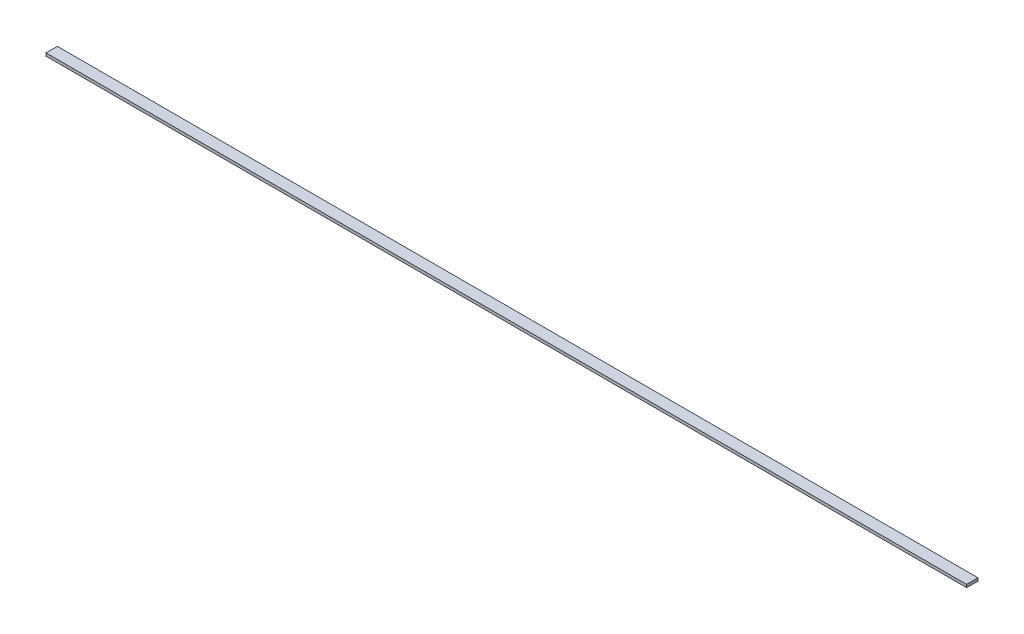
ISO-10303-21;
HEADER;
FILE_DESCRIPTION(('STEP AP214'),'2;1');
FILE_NAME('part.step','',(''),(''),'','','');
FILE_SCHEMA(('AUTOMOTIVE_DESIGN { 1 0 10303 214 1 1 1 1 }'));
ENDSEC;
DATA;
#1=APPLICATION_CONTEXT('core data for automotive mechanical design processes');
#2=APPLICATION_PROTOCOL_DEFINITION('international standard','automotive_design',2000,#1);
#3=PRODUCT_CONTEXT('',#1,'mechanical');
#4=PRODUCT('Part','Part','',(#3));
#5=PRODUCT_RELATED_PRODUCT_CATEGORY('part','',(#4));
#6=PRODUCT_DEFINITION_FORMATION('','',#4);
#7=PRODUCT_DEFINITION_CONTEXT('part definition',#1,'design');
#8=PRODUCT_DEFINITION('design','',#6,#7);
#9=PRODUCT_DEFINITION_SHAPE('','',#8);
#10=(LENGTH_UNIT() NAMED_UNIT(*) SI_UNIT(.MILLI.,.METRE.));
#11=(NAMED_UNIT(*) PLANE_ANGLE_UNIT() SI_UNIT($,.RADIAN.));
#12=(NAMED_UNIT(*) SI_UNIT($,.STERADIAN.) SOLID_ANGLE_UNIT());
#13=UNCERTAINTY_MEASURE_WITH_UNIT(LENGTH_MEASURE(1.E-05),#10,'distance_accuracy_value','');
#14=(GEOMETRIC_REPRESENTATION_CONTEXT(3) GLOBAL_UNCERTAINTY_ASSIGNED_CONTEXT((#13)) GLOBAL_UNIT_ASSIGNED_CONTEXT((#10,
#11,#12)) REPRESENTATION_CONTEXT('',''));
#15=CARTESIAN_POINT('',(0.,0.,0.));
#16=DIRECTION('',(0.,0.,1.));
#17=DIRECTION('',(1.,0.,0.));
#18=AXIS2_PLACEMENT_3D('',#15,#16,#17);
#19=CARTESIAN_POINT('',(0.,1.5,0.));
#20=DIRECTION('',(1.,0.,0.));
#21=DIRECTION('',(0.,0.,-1.));
#22=AXIS2_PLACEMENT_3D('',#19,#20,#21);
#23=PLANE('',#22);
#24=DIRECTION('',(0.,0.,1.));
#25=VECTOR('',#24,1.);
#26=CARTESIAN_POINT('',(0.,0.,0.));
#27=LINE('',#26,#25);
#28=CARTESIAN_POINT('',(0.,0.,0.));
#29=VERTEX_POINT('',#28);
#30=CARTESIAN_POINT('',(0.,0.,6.));
#31=VERTEX_POINT('',#30);
#32=EDGE_CURVE('E107',#29,#31,#27,.T.);
#33=ORIENTED_EDGE('',*,*,#32,.T.);
#34=DIRECTION('',(0.,-1.,0.));
#35=VECTOR('',#34,1.);
#36=CARTESIAN_POINT('',(0.,1.5,6.));
#37=LINE('',#36,#35);
#38=CARTESIAN_POINT('',(0.,1.5,6.));
#39=VERTEX_POINT('',#38);
#40=EDGE_CURVE('E11',#39,#31,#37,.T.);
#41=ORIENTED_EDGE('',*,*,#40,.F.);
#42=DIRECTION('',(0.,0.,1.));
#43=VECTOR('',#42,1.);
#44=CARTESIAN_POINT('',(0.,1.5,0.));
#45=LINE('',#44,#43);
#46=CARTESIAN_POINT('',(0.,1.5,0.));
#47=VERTEX_POINT('',#46);
#48=EDGE_CURVE('E91',#47,#39,#45,.T.);
#49=ORIENTED_EDGE('',*,*,#48,.F.);
#50=DIRECTION('',(0.,-1.,0.));
#51=VECTOR('',#50,1.);
#52=CARTESIAN_POINT('',(0.,1.5,0.));
#53=LINE('',#52,#51);
#54=EDGE_CURVE('E103',#47,#29,#53,.T.);
#55=ORIENTED_EDGE('',*,*,#54,.T.);
#56=EDGE_LOOP('',(#33,#41,#49,#55));
#57=FACE_BOUND('',#56,.T.);
#58=ADVANCED_FACE('F39',(#57),#23,.F.);
#59=CARTESIAN_POINT('',(0.,1.5,6.));
#60=DIRECTION('',(0.,0.,-1.));
#61=DIRECTION('',(-1.,0.,0.));
#62=AXIS2_PLACEMENT_3D('',#59,#60,#61);
#63=PLANE('',#62);
#64=DIRECTION('',(1.,0.,0.));
#65=VECTOR('',#64,1.);
#66=CARTESIAN_POINT('',(0.,0.,6.));
#67=LINE('',#66,#65);
#68=CARTESIAN_POINT('',(485.,0.,6.));
#69=VERTEX_POINT('',#68);
#70=EDGE_CURVE('E96',#31,#69,#67,.T.);
#71=ORIENTED_EDGE('',*,*,#70,.T.);
#72=DIRECTION('',(0.,-1.,0.));
#73=VECTOR('',#72,1.);
#74=CARTESIAN_POINT('',(485.,1.5,6.));
#75=LINE('',#74,#73);
#76=CARTESIAN_POINT('',(485.,1.5,6.));
#77=VERTEX_POINT('',#76);
#78=EDGE_CURVE('E48',#77,#69,#75,.T.);
#79=ORIENTED_EDGE('',*,*,#78,.F.);
#80=DIRECTION('',(1.,0.,0.));
#81=VECTOR('',#80,1.);
#82=CARTESIAN_POINT('',(0.,1.5,6.));
#83=LINE('',#82,#81);
#84=EDGE_CURVE('E86',#39,#77,#83,.T.);
#85=ORIENTED_EDGE('',*,*,#84,.F.);
#86=ORIENTED_EDGE('',*,*,#40,.T.);
#87=EDGE_LOOP('',(#71,#79,#85,#86));
#88=FACE_BOUND('',#87,.T.);
#89=ADVANCED_FACE('F95',(#88),#63,.F.);
#90=CARTESIAN_POINT('',(485.,1.5,0.));
#91=DIRECTION('',(-1.,0.,0.));
#92=DIRECTION('',(0.,0.,1.));
#93=AXIS2_PLACEMENT_3D('',#90,#91,#92);
#94=PLANE('',#93);
#95=DIRECTION('',(0.,0.,-1.));
#96=VECTOR('',#95,1.);
#97=CARTESIAN_POINT('',(485.,0.,0.));
#98=LINE('',#97,#96);
#99=CARTESIAN_POINT('',(485.,0.,0.));
#100=VERTEX_POINT('',#99);
#101=EDGE_CURVE('E73',#69,#100,#98,.T.);
#102=ORIENTED_EDGE('',*,*,#101,.T.);
#103=DIRECTION('',(0.,-1.,0.));
#104=VECTOR('',#103,1.);
#105=CARTESIAN_POINT('',(485.,1.5,0.));
#106=LINE('',#105,#104);
#107=CARTESIAN_POINT('',(485.,1.5,0.));
#108=VERTEX_POINT('',#107);
#109=EDGE_CURVE('E98',#108,#100,#106,.T.);
#110=ORIENTED_EDGE('',*,*,#109,.F.);
#111=DIRECTION('',(0.,0.,-1.));
#112=VECTOR('',#111,1.);
#113=CARTESIAN_POINT('',(485.,1.5,0.));
#114=LINE('',#113,#112);
#115=EDGE_CURVE('E89',#77,#108,#114,.T.);
#116=ORIENTED_EDGE('',*,*,#115,.F.);
#117=ORIENTED_EDGE('',*,*,#78,.T.);
#118=EDGE_LOOP('',(#102,#110,#116,#117));
#119=FACE_BOUND('',#118,.T.);
#120=ADVANCED_FACE('F99',(#119),#94,.F.);
#121=CARTESIAN_POINT('',(0.,1.5,0.));
#122=DIRECTION('',(0.,0.,1.));
#123=DIRECTION('',(1.,0.,0.));
#124=AXIS2_PLACEMENT_3D('',#121,#122,#123);
#125=PLANE('',#124);
#126=DIRECTION('',(-1.,0.,0.));
#127=VECTOR('',#126,1.);
#128=CARTESIAN_POINT('',(0.,0.,0.));
#129=LINE('',#128,#127);
#130=EDGE_CURVE('E79',#100,#29,#129,.T.);
#131=ORIENTED_EDGE('',*,*,#130,.T.);
#132=ORIENTED_EDGE('',*,*,#54,.F.);
#133=DIRECTION('',(-1.,0.,0.));
#134=VECTOR('',#133,1.);
#135=CARTESIAN_POINT('',(0.,1.5,0.));
#136=LINE('',#135,#134);
#137=EDGE_CURVE('E56',#108,#47,#136,.T.);
#138=ORIENTED_EDGE('',*,*,#137,.F.);
#139=ORIENTED_EDGE('',*,*,#109,.T.);
#140=EDGE_LOOP('',(#131,#132,#138,#139));
#141=FACE_BOUND('',#140,.T.);
#142=ADVANCED_FACE('F120',(#141),#125,.F.);
#143=CARTESIAN_POINT('',(0.,1.5,0.));
#144=DIRECTION('',(0.,1.,0.));
#145=DIRECTION('',(0.,0.,1.));
#146=AXIS2_PLACEMENT_3D('',#143,#144,#145);
#147=PLANE('',#146);
#148=ORIENTED_EDGE('',*,*,#48,.T.);
#149=ORIENTED_EDGE('',*,*,#84,.T.);
#150=ORIENTED_EDGE('',*,*,#115,.T.);
#151=ORIENTED_EDGE('',*,*,#137,.T.);
#152=EDGE_LOOP('',(#148,#149,#150,#151));
#153=FACE_BOUND('',#152,.T.);
#154=ADVANCED_FACE('F87',(#153),#147,.T.);
#155=CARTESIAN_POINT('',(0.,0.,0.));
#156=DIRECTION('',(0.,1.,0.));
#157=DIRECTION('',(0.,0.,1.));
#158=AXIS2_PLACEMENT_3D('',#155,#156,#157);
#159=PLANE('',#158);
#160=ORIENTED_EDGE('',*,*,#32,.F.);
#161=ORIENTED_EDGE('',*,*,#130,.F.);
#162=ORIENTED_EDGE('',*,*,#101,.F.);
#163=ORIENTED_EDGE('',*,*,#70,.F.);
#164=EDGE_LOOP('',(#160,#161,#162,#163));
#165=FACE_BOUND('',#164,.T.);
#166=ADVANCED_FACE('F123',(#165),#159,.F.);
#167=CLOSED_SHELL('',(#58,#89,#120,#142,#154,#166));
#168=MANIFOLD_SOLID_BREP('B2',#167);
#169=ADVANCED_BREP_SHAPE_REPRESENTATION('',(#18,#168),#14);
#170=SHAPE_DEFINITION_REPRESENTATION(#9,#169);
ENDSEC;
END-ISO-10303-21;
